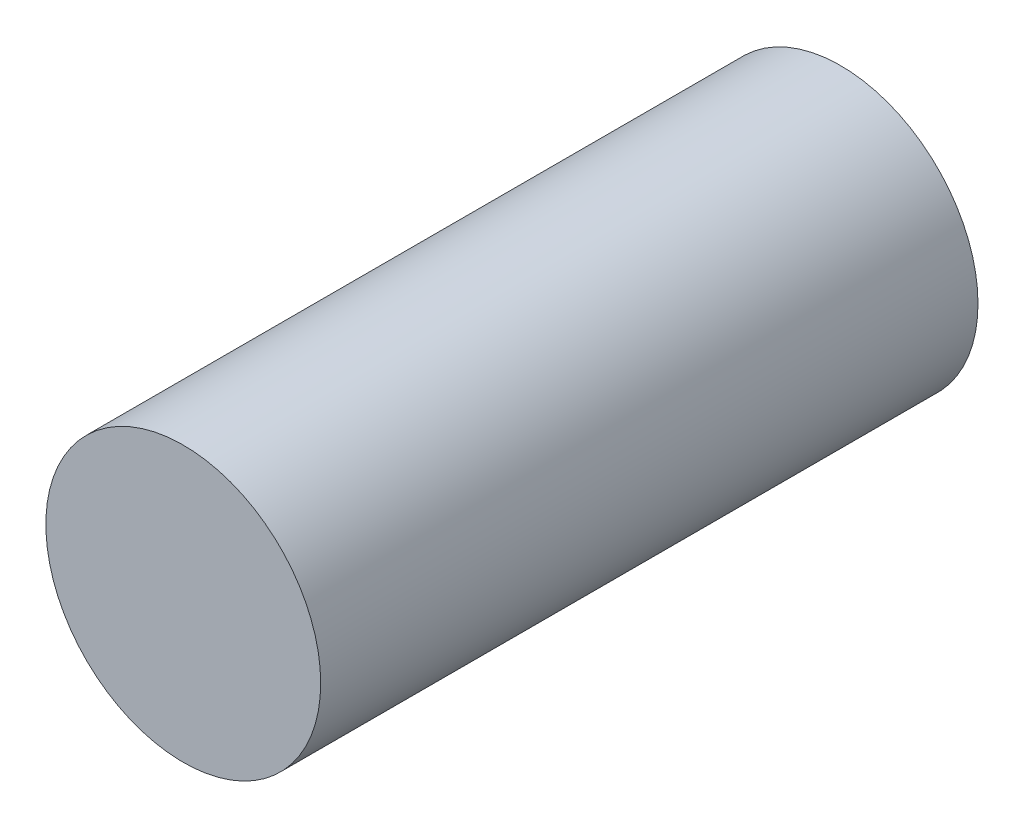
ISO-10303-21;
HEADER;
FILE_DESCRIPTION(('STEP AP214'),'2;1');
FILE_NAME('part.step','',(''),(''),'','','');
FILE_SCHEMA(('AUTOMOTIVE_DESIGN { 1 0 10303 214 1 1 1 1 }'));
ENDSEC;
DATA;
#1=APPLICATION_CONTEXT('core data for automotive mechanical design processes');
#2=APPLICATION_PROTOCOL_DEFINITION('international standard','automotive_design',2000,#1);
#3=PRODUCT_CONTEXT('',#1,'mechanical');
#4=PRODUCT('Part','Part','',(#3));
#5=PRODUCT_RELATED_PRODUCT_CATEGORY('part','',(#4));
#6=PRODUCT_DEFINITION_FORMATION('','',#4);
#7=PRODUCT_DEFINITION_CONTEXT('part definition',#1,'design');
#8=PRODUCT_DEFINITION('design','',#6,#7);
#9=PRODUCT_DEFINITION_SHAPE('','',#8);
#10=(LENGTH_UNIT() NAMED_UNIT(*) SI_UNIT(.MILLI.,.METRE.));
#11=(NAMED_UNIT(*) PLANE_ANGLE_UNIT() SI_UNIT($,.RADIAN.));
#12=(NAMED_UNIT(*) SI_UNIT($,.STERADIAN.) SOLID_ANGLE_UNIT());
#13=UNCERTAINTY_MEASURE_WITH_UNIT(LENGTH_MEASURE(1.E-05),#10,'distance_accuracy_value','');
#14=(GEOMETRIC_REPRESENTATION_CONTEXT(3) GLOBAL_UNCERTAINTY_ASSIGNED_CONTEXT((#13)) GLOBAL_UNIT_ASSIGNED_CONTEXT((#10,
#11,#12)) REPRESENTATION_CONTEXT('',''));
#15=CARTESIAN_POINT('',(0.,0.,0.));
#16=DIRECTION('',(0.,0.,1.));
#17=DIRECTION('',(1.,0.,0.));
#18=AXIS2_PLACEMENT_3D('',#15,#16,#17);
#19=CARTESIAN_POINT('',(-0.260648898686456,10.6178112420458,25.4));
#20=DIRECTION('',(0.,0.,-1.));
#21=DIRECTION('',(-1.,0.,0.));
#22=AXIS2_PLACEMENT_3D('',#19,#20,#21);
#23=CYLINDRICAL_SURFACE('',#22,10.62101);
#24=CARTESIAN_POINT('',(-0.260648898686456,10.6178112420458,25.4));
#25=DIRECTION('',(0.,0.,1.));
#26=DIRECTION('',(1.,0.,0.));
#27=AXIS2_PLACEMENT_3D('',#24,#25,#26);
#28=CIRCLE('',#27,10.62101);
#29=CARTESIAN_POINT('',(10.3603611013135,10.6178112420458,25.4));
#30=VERTEX_POINT('',#29);
#31=EDGE_CURVE('E10',#30,#30,#28,.T.);
#32=ORIENTED_EDGE('',*,*,#31,.F.);
#33=EDGE_LOOP('',(#32));
#34=FACE_BOUND('',#33,.T.);
#35=CARTESIAN_POINT('',(-0.260648898686456,10.6178112420458,-25.4));
#36=DIRECTION('',(0.,0.,1.));
#37=DIRECTION('',(1.,0.,0.));
#38=AXIS2_PLACEMENT_3D('',#35,#36,#37);
#39=CIRCLE('',#38,10.62101);
#40=CARTESIAN_POINT('',(10.3603611013135,10.6178112420458,-25.4));
#41=VERTEX_POINT('',#40);
#42=EDGE_CURVE('E34',#41,#41,#39,.T.);
#43=ORIENTED_EDGE('',*,*,#42,.T.);
#44=EDGE_LOOP('',(#43));
#45=FACE_BOUND('',#44,.T.);
#46=ADVANCED_FACE('F31',(#34,#45),#23,.T.);
#47=CARTESIAN_POINT('',(-0.260648898686456,10.6178112420458,25.4));
#48=DIRECTION('',(0.,0.,1.));
#49=DIRECTION('',(1.,0.,0.));
#50=AXIS2_PLACEMENT_3D('',#47,#48,#49);
#51=PLANE('',#50);
#52=ORIENTED_EDGE('',*,*,#31,.T.);
#53=EDGE_LOOP('',(#52));
#54=FACE_BOUND('',#53,.T.);
#55=ADVANCED_FACE('F46',(#54),#51,.T.);
#56=CARTESIAN_POINT('',(-0.260648898686456,10.6178112420458,-25.4));
#57=DIRECTION('',(0.,0.,1.));
#58=DIRECTION('',(1.,0.,0.));
#59=AXIS2_PLACEMENT_3D('',#56,#57,#58);
#60=PLANE('',#59);
#61=ORIENTED_EDGE('',*,*,#42,.F.);
#62=EDGE_LOOP('',(#61));
#63=FACE_BOUND('',#62,.T.);
#64=ADVANCED_FACE('F44',(#63),#60,.F.);
#65=CLOSED_SHELL('',(#46,#55,#64));
#66=MANIFOLD_SOLID_BREP('B2',#65);
#67=ADVANCED_BREP_SHAPE_REPRESENTATION('',(#18,#66),#14);
#68=SHAPE_DEFINITION_REPRESENTATION(#9,#67);
ENDSEC;
END-ISO-10303-21;
